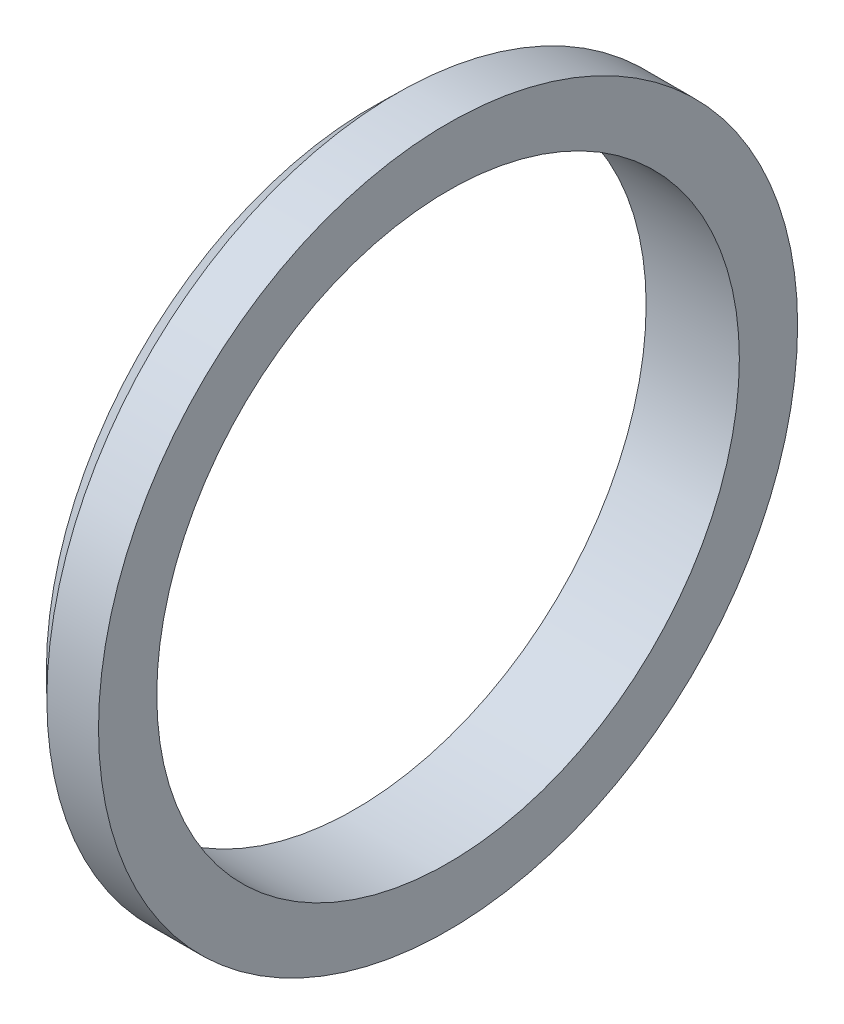
ISO-10303-21;
HEADER;
FILE_DESCRIPTION(('STEP AP214'),'2;1');
FILE_NAME('part.step','',(''),(''),'','','');
FILE_SCHEMA(('AUTOMOTIVE_DESIGN { 1 0 10303 214 1 1 1 1 }'));
ENDSEC;
DATA;
#1=APPLICATION_CONTEXT('core data for automotive mechanical design processes');
#2=APPLICATION_PROTOCOL_DEFINITION('international standard','automotive_design',2000,#1);
#3=PRODUCT_CONTEXT('',#1,'mechanical');
#4=PRODUCT('Part','Part','',(#3));
#5=PRODUCT_RELATED_PRODUCT_CATEGORY('part','',(#4));
#6=PRODUCT_DEFINITION_FORMATION('','',#4);
#7=PRODUCT_DEFINITION_CONTEXT('part definition',#1,'design');
#8=PRODUCT_DEFINITION('design','',#6,#7);
#9=PRODUCT_DEFINITION_SHAPE('','',#8);
#10=(LENGTH_UNIT() NAMED_UNIT(*) SI_UNIT(.MILLI.,.METRE.));
#11=(NAMED_UNIT(*) PLANE_ANGLE_UNIT() SI_UNIT($,.RADIAN.));
#12=(NAMED_UNIT(*) SI_UNIT($,.STERADIAN.) SOLID_ANGLE_UNIT());
#13=UNCERTAINTY_MEASURE_WITH_UNIT(LENGTH_MEASURE(1.E-05),#10,'distance_accuracy_value','');
#14=(GEOMETRIC_REPRESENTATION_CONTEXT(3) GLOBAL_UNCERTAINTY_ASSIGNED_CONTEXT((#13)) GLOBAL_UNIT_ASSIGNED_CONTEXT((#10,
#11,#12)) REPRESENTATION_CONTEXT('',''));
#15=CARTESIAN_POINT('',(0.,0.,0.));
#16=DIRECTION('',(0.,0.,1.));
#17=DIRECTION('',(1.,0.,0.));
#18=AXIS2_PLACEMENT_3D('',#15,#16,#17);
#19=CARTESIAN_POINT('',(-0.0743451521182824,12.8161046926303,0.));
#20=DIRECTION('',(1.,0.,0.));
#21=DIRECTION('',(0.,0.,-1.));
#22=AXIS2_PLACEMENT_3D('',#19,#20,#21);
#23=PLANE('',#22);
#24=CARTESIAN_POINT('',(-0.0743451521182824,0.,0.));
#25=DIRECTION('',(-1.,0.,0.));
#26=DIRECTION('',(0.,0.,1.));
#27=AXIS2_PLACEMENT_3D('',#24,#25,#26);
#28=CIRCLE('',#27,12.5);
#29=CARTESIAN_POINT('',(-0.0743451521182824,0.,12.5));
#30=VERTEX_POINT('',#29);
#31=EDGE_CURVE('E10',#30,#30,#28,.T.);
#32=ORIENTED_EDGE('',*,*,#31,.F.);
#33=EDGE_LOOP('',(#32));
#34=FACE_BOUND('',#33,.T.);
#35=CARTESIAN_POINT('',(-0.0743451521182825,0.,0.));
#36=DIRECTION('',(-1.,0.,0.));
#37=DIRECTION('',(0.,0.,1.));
#38=AXIS2_PLACEMENT_3D('',#35,#36,#37);
#39=CIRCLE('',#38,12.8161046926303);
#40=CARTESIAN_POINT('',(-0.0743451521182825,0.,12.8161046926303));
#41=VERTEX_POINT('',#40);
#42=EDGE_CURVE('E58',#41,#41,#39,.T.);
#43=ORIENTED_EDGE('',*,*,#42,.T.);
#44=EDGE_LOOP('',(#43));
#45=FACE_BOUND('',#44,.T.);
#46=ADVANCED_FACE('F30',(#34,#45),#23,.F.);
#47=CARTESIAN_POINT('',(0.,0.,0.));
#48=DIRECTION('',(-1.,0.,0.));
#49=DIRECTION('',(0.,0.,1.));
#50=AXIS2_PLACEMENT_3D('',#47,#48,#49);
#51=CYLINDRICAL_SURFACE('',#50,12.5);
#52=CARTESIAN_POINT('',(3.92565484788172,0.,0.));
#53=DIRECTION('',(-1.,0.,0.));
#54=DIRECTION('',(0.,0.,1.));
#55=AXIS2_PLACEMENT_3D('',#52,#53,#54);
#56=CIRCLE('',#55,12.5);
#57=CARTESIAN_POINT('',(3.92565484788172,0.,12.5));
#58=VERTEX_POINT('',#57);
#59=EDGE_CURVE('E36',#58,#58,#56,.T.);
#60=ORIENTED_EDGE('',*,*,#59,.F.);
#61=EDGE_LOOP('',(#60));
#62=FACE_BOUND('',#61,.T.);
#63=ORIENTED_EDGE('',*,*,#31,.T.);
#64=EDGE_LOOP('',(#63));
#65=FACE_BOUND('',#64,.T.);
#66=ADVANCED_FACE('F95',(#62,#65),#51,.F.);
#67=CARTESIAN_POINT('',(3.92565484788172,12.5,0.));
#68=DIRECTION('',(-1.,0.,0.));
#69=DIRECTION('',(0.,0.,1.));
#70=AXIS2_PLACEMENT_3D('',#67,#68,#69);
#71=PLANE('',#70);
#72=CARTESIAN_POINT('',(3.92565484788172,0.,0.));
#73=DIRECTION('',(-1.,0.,0.));
#74=DIRECTION('',(0.,0.,1.));
#75=AXIS2_PLACEMENT_3D('',#72,#73,#74);
#76=CIRCLE('',#75,15.);
#77=CARTESIAN_POINT('',(3.92565484788172,0.,15.));
#78=VERTEX_POINT('',#77);
#79=EDGE_CURVE('E40',#78,#78,#76,.T.);
#80=ORIENTED_EDGE('',*,*,#79,.F.);
#81=EDGE_LOOP('',(#80));
#82=FACE_BOUND('',#81,.T.);
#83=ORIENTED_EDGE('',*,*,#59,.T.);
#84=EDGE_LOOP('',(#83));
#85=FACE_BOUND('',#84,.T.);
#86=ADVANCED_FACE('F90',(#82,#85),#71,.F.);
#87=CARTESIAN_POINT('',(0.,0.,0.));
#88=DIRECTION('',(-1.,0.,0.));
#89=DIRECTION('',(0.,0.,1.));
#90=AXIS2_PLACEMENT_3D('',#87,#88,#89);
#91=CYLINDRICAL_SURFACE('',#90,15.);
#92=CARTESIAN_POINT('',(1.70845546118096,0.,0.));
#93=DIRECTION('',(-1.,0.,0.));
#94=DIRECTION('',(0.,0.,1.));
#95=AXIS2_PLACEMENT_3D('',#92,#93,#94);
#96=CIRCLE('',#95,15.);
#97=CARTESIAN_POINT('',(1.70845546118096,0.,15.));
#98=VERTEX_POINT('',#97);
#99=EDGE_CURVE('E44',#98,#98,#96,.T.);
#100=ORIENTED_EDGE('',*,*,#99,.F.);
#101=EDGE_LOOP('',(#100));
#102=FACE_BOUND('',#101,.T.);
#103=ORIENTED_EDGE('',*,*,#79,.T.);
#104=EDGE_LOOP('',(#103));
#105=FACE_BOUND('',#104,.T.);
#106=ADVANCED_FACE('F84',(#102,#105),#91,.T.);
#107=CARTESIAN_POINT('',(1.70845546118096,0.,0.));
#108=DIRECTION('',(1.,0.,0.));
#109=DIRECTION('',(0.,0.,-1.));
#110=AXIS2_PLACEMENT_3D('',#107,#108,#109);
#111=CONICAL_SURFACE('',#110,15.,0.776315606304508);
#112=CARTESIAN_POINT('',(0.633473343817036,0.,0.));
#113=DIRECTION('',(-1.,0.,0.));
#114=DIRECTION('',(0.,0.,1.));
#115=AXIS2_PLACEMENT_3D('',#112,#113,#114);
#116=CIRCLE('',#115,13.9443698225815);
#117=CARTESIAN_POINT('',(0.633473343817036,0.,13.9443698225815));
#118=VERTEX_POINT('',#117);
#119=EDGE_CURVE('E49',#118,#118,#116,.T.);
#120=ORIENTED_EDGE('',*,*,#119,.F.);
#121=EDGE_LOOP('',(#120));
#122=FACE_BOUND('',#121,.T.);
#123=ORIENTED_EDGE('',*,*,#99,.T.);
#124=EDGE_LOOP('',(#123));
#125=FACE_BOUND('',#124,.T.);
#126=ADVANCED_FACE('F78',(#122,#125),#111,.T.);
#127=CARTESIAN_POINT('',(0.633473343817036,13.1322093852606,0.));
#128=DIRECTION('',(1.,0.,0.));
#129=DIRECTION('',(0.,0.,-1.));
#130=AXIS2_PLACEMENT_3D('',#127,#128,#129);
#131=PLANE('',#130);
#132=CARTESIAN_POINT('',(0.633473343817036,0.,0.));
#133=DIRECTION('',(-1.,0.,0.));
#134=DIRECTION('',(0.,0.,1.));
#135=AXIS2_PLACEMENT_3D('',#132,#133,#134);
#136=CIRCLE('',#135,13.1322093852606);
#137=CARTESIAN_POINT('',(0.633473343817036,0.,13.1322093852606));
#138=VERTEX_POINT('',#137);
#139=EDGE_CURVE('E52',#138,#138,#136,.T.);
#140=ORIENTED_EDGE('',*,*,#139,.F.);
#141=EDGE_LOOP('',(#140));
#142=FACE_BOUND('',#141,.T.);
#143=ORIENTED_EDGE('',*,*,#119,.T.);
#144=EDGE_LOOP('',(#143));
#145=FACE_BOUND('',#144,.T.);
#146=ADVANCED_FACE('F72',(#142,#145),#131,.F.);
#147=CARTESIAN_POINT('',(0.,0.,0.));
#148=DIRECTION('',(-1.,0.,0.));
#149=DIRECTION('',(0.,0.,1.));
#150=AXIS2_PLACEMENT_3D('',#147,#148,#149);
#151=CYLINDRICAL_SURFACE('',#150,13.1322093852606);
#152=CARTESIAN_POINT('',(0.213761608368111,0.,0.));
#153=DIRECTION('',(-1.,0.,0.));
#154=DIRECTION('',(0.,0.,1.));
#155=AXIS2_PLACEMENT_3D('',#152,#153,#154);
#156=CIRCLE('',#155,13.1322093852606);
#157=CARTESIAN_POINT('',(0.213761608368111,0.,13.1322093852606));
#158=VERTEX_POINT('',#157);
#159=EDGE_CURVE('E55',#158,#158,#156,.T.);
#160=ORIENTED_EDGE('',*,*,#159,.F.);
#161=EDGE_LOOP('',(#160));
#162=FACE_BOUND('',#161,.T.);
#163=ORIENTED_EDGE('',*,*,#139,.T.);
#164=EDGE_LOOP('',(#163));
#165=FACE_BOUND('',#164,.T.);
#166=ADVANCED_FACE('F66',(#162,#165),#151,.T.);
#167=CARTESIAN_POINT('',(0.213761608368111,0.,0.));
#168=DIRECTION('',(1.,0.,0.));
#169=DIRECTION('',(0.,0.,-1.));
#170=AXIS2_PLACEMENT_3D('',#167,#168,#169);
#171=CONICAL_SURFACE('',#170,13.1322093852606,0.831703010242158);
#172=ORIENTED_EDGE('',*,*,#42,.F.);
#173=EDGE_LOOP('',(#172));
#174=FACE_BOUND('',#173,.T.);
#175=ORIENTED_EDGE('',*,*,#159,.T.);
#176=EDGE_LOOP('',(#175));
#177=FACE_BOUND('',#176,.T.);
#178=ADVANCED_FACE('F63',(#174,#177),#171,.T.);
#179=CLOSED_SHELL('',(#46,#66,#86,#106,#126,#146,#166,#178));
#180=MANIFOLD_SOLID_BREP('B2',#179);
#181=ADVANCED_BREP_SHAPE_REPRESENTATION('',(#18,#180),#14);
#182=SHAPE_DEFINITION_REPRESENTATION(#9,#181);
ENDSEC;
END-ISO-10303-21;
